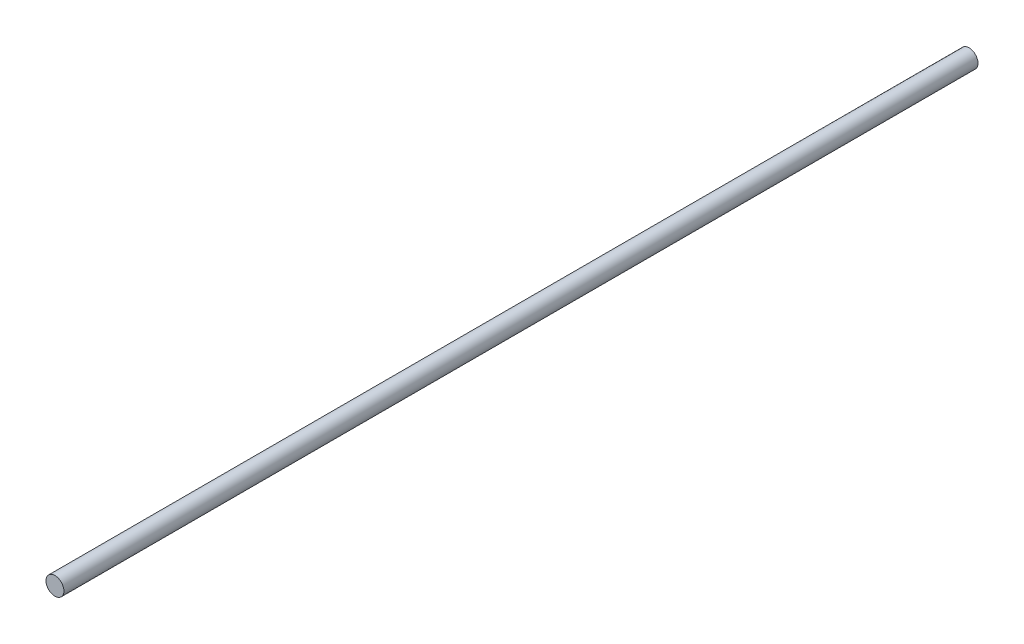
ISO-10303-21;
HEADER;
FILE_DESCRIPTION(('STEP AP214'),'2;1');
FILE_NAME('part.step','',(''),(''),'','','');
FILE_SCHEMA(('AUTOMOTIVE_DESIGN { 1 0 10303 214 1 1 1 1 }'));
ENDSEC;
DATA;
#1=APPLICATION_CONTEXT('core data for automotive mechanical design processes');
#2=APPLICATION_PROTOCOL_DEFINITION('international standard','automotive_design',2000,#1);
#3=PRODUCT_CONTEXT('',#1,'mechanical');
#4=PRODUCT('Part','Part','',(#3));
#5=PRODUCT_RELATED_PRODUCT_CATEGORY('part','',(#4));
#6=PRODUCT_DEFINITION_FORMATION('','',#4);
#7=PRODUCT_DEFINITION_CONTEXT('part definition',#1,'design');
#8=PRODUCT_DEFINITION('design','',#6,#7);
#9=PRODUCT_DEFINITION_SHAPE('','',#8);
#10=(LENGTH_UNIT() NAMED_UNIT(*) SI_UNIT(.MILLI.,.METRE.));
#11=(NAMED_UNIT(*) PLANE_ANGLE_UNIT() SI_UNIT($,.RADIAN.));
#12=(NAMED_UNIT(*) SI_UNIT($,.STERADIAN.) SOLID_ANGLE_UNIT());
#13=UNCERTAINTY_MEASURE_WITH_UNIT(LENGTH_MEASURE(1.E-05),#10,'distance_accuracy_value','');
#14=(GEOMETRIC_REPRESENTATION_CONTEXT(3) GLOBAL_UNCERTAINTY_ASSIGNED_CONTEXT((#13)) GLOBAL_UNIT_ASSIGNED_CONTEXT((#10,
#11,#12)) REPRESENTATION_CONTEXT('',''));
#15=CARTESIAN_POINT('',(0.,0.,0.));
#16=DIRECTION('',(0.,0.,1.));
#17=DIRECTION('',(1.,0.,0.));
#18=AXIS2_PLACEMENT_3D('',#15,#16,#17);
#19=CARTESIAN_POINT('',(0.,0.,510.));
#20=DIRECTION('',(0.,0.,-1.));
#21=DIRECTION('',(-1.,0.,0.));
#22=AXIS2_PLACEMENT_3D('',#19,#20,#21);
#23=CYLINDRICAL_SURFACE('',#22,5.);
#24=CARTESIAN_POINT('',(0.,0.,510.));
#25=DIRECTION('',(0.,0.,1.));
#26=DIRECTION('',(1.,0.,0.));
#27=AXIS2_PLACEMENT_3D('',#24,#25,#26);
#28=CIRCLE('',#27,5.);
#29=CARTESIAN_POINT('',(5.,0.,510.));
#30=VERTEX_POINT('',#29);
#31=EDGE_CURVE('E10',#30,#30,#28,.T.);
#32=ORIENTED_EDGE('',*,*,#31,.F.);
#33=EDGE_LOOP('',(#32));
#34=FACE_BOUND('',#33,.T.);
#35=CARTESIAN_POINT('',(0.,0.,0.));
#36=DIRECTION('',(0.,0.,1.));
#37=DIRECTION('',(1.,0.,0.));
#38=AXIS2_PLACEMENT_3D('',#35,#36,#37);
#39=CIRCLE('',#38,5.);
#40=CARTESIAN_POINT('',(5.,0.,0.));
#41=VERTEX_POINT('',#40);
#42=EDGE_CURVE('E38',#41,#41,#39,.T.);
#43=ORIENTED_EDGE('',*,*,#42,.T.);
#44=EDGE_LOOP('',(#43));
#45=FACE_BOUND('',#44,.T.);
#46=ADVANCED_FACE('F35',(#34,#45),#23,.T.);
#47=CARTESIAN_POINT('',(0.,0.,510.));
#48=DIRECTION('',(0.,0.,1.));
#49=DIRECTION('',(1.,0.,0.));
#50=AXIS2_PLACEMENT_3D('',#47,#48,#49);
#51=PLANE('',#50);
#52=ORIENTED_EDGE('',*,*,#31,.T.);
#53=EDGE_LOOP('',(#52));
#54=FACE_BOUND('',#53,.T.);
#55=ADVANCED_FACE('F50',(#54),#51,.T.);
#56=CARTESIAN_POINT('',(0.,0.,0.));
#57=DIRECTION('',(0.,0.,1.));
#58=DIRECTION('',(1.,0.,0.));
#59=AXIS2_PLACEMENT_3D('',#56,#57,#58);
#60=PLANE('',#59);
#61=ORIENTED_EDGE('',*,*,#42,.F.);
#62=EDGE_LOOP('',(#61));
#63=FACE_BOUND('',#62,.T.);
#64=ADVANCED_FACE('F48',(#63),#60,.F.);
#65=CLOSED_SHELL('',(#46,#55,#64));
#66=MANIFOLD_SOLID_BREP('B2',#65);
#67=ADVANCED_BREP_SHAPE_REPRESENTATION('',(#18,#66),#14);
#68=SHAPE_DEFINITION_REPRESENTATION(#9,#67);
ENDSEC;
END-ISO-10303-21;
